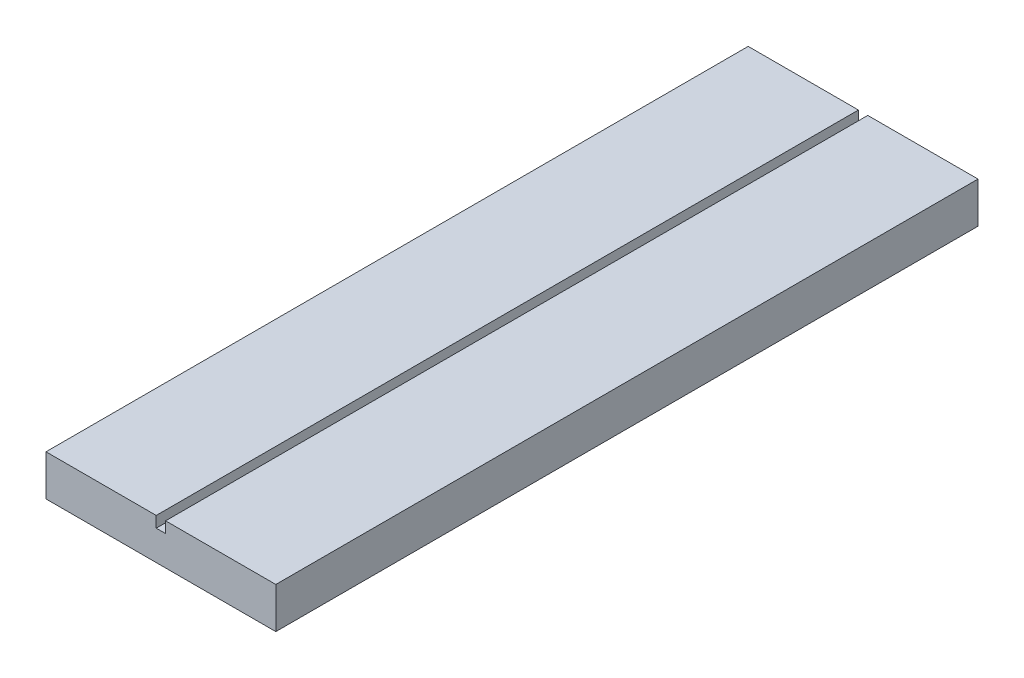
ISO-10303-21;
HEADER;
FILE_DESCRIPTION(('STEP AP214'),'2;1');
FILE_NAME('part.step','',(''),(''),'','','');
FILE_SCHEMA(('AUTOMOTIVE_DESIGN { 1 0 10303 214 1 1 1 1 }'));
ENDSEC;
DATA;
#1=APPLICATION_CONTEXT('core data for automotive mechanical design processes');
#2=APPLICATION_PROTOCOL_DEFINITION('international standard','automotive_design',2000,#1);
#3=PRODUCT_CONTEXT('',#1,'mechanical');
#4=PRODUCT('Part','Part','',(#3));
#5=PRODUCT_RELATED_PRODUCT_CATEGORY('part','',(#4));
#6=PRODUCT_DEFINITION_FORMATION('','',#4);
#7=PRODUCT_DEFINITION_CONTEXT('part definition',#1,'design');
#8=PRODUCT_DEFINITION('design','',#6,#7);
#9=PRODUCT_DEFINITION_SHAPE('','',#8);
#10=(LENGTH_UNIT() NAMED_UNIT(*) SI_UNIT(.MILLI.,.METRE.));
#11=(NAMED_UNIT(*) PLANE_ANGLE_UNIT() SI_UNIT($,.RADIAN.));
#12=(NAMED_UNIT(*) SI_UNIT($,.STERADIAN.) SOLID_ANGLE_UNIT());
#13=UNCERTAINTY_MEASURE_WITH_UNIT(LENGTH_MEASURE(1.E-05),#10,'distance_accuracy_value','');
#14=(GEOMETRIC_REPRESENTATION_CONTEXT(3) GLOBAL_UNCERTAINTY_ASSIGNED_CONTEXT((#13)) GLOBAL_UNIT_ASSIGNED_CONTEXT((#10,
#11,#12)) REPRESENTATION_CONTEXT('',''));
#15=CARTESIAN_POINT('',(0.,0.,0.));
#16=DIRECTION('',(0.,0.,1.));
#17=DIRECTION('',(1.,0.,0.));
#18=AXIS2_PLACEMENT_3D('',#15,#16,#17);
#19=CARTESIAN_POINT('',(0.,7.,0.));
#20=DIRECTION('',(0.,1.,0.));
#21=DIRECTION('',(1.,0.,0.));
#22=AXIS2_PLACEMENT_3D('',#19,#20,#21);
#23=PLANE('',#22);
#24=DIRECTION('',(-1.,0.,0.));
#25=VECTOR('',#24,1.);
#26=CARTESIAN_POINT('',(1.10000000000002,7.,-82.5));
#27=LINE('',#26,#25);
#28=CARTESIAN_POINT('',(1.10000000000002,7.,-82.5));
#29=VERTEX_POINT('',#28);
#30=CARTESIAN_POINT('',(-1.1,7.,-82.5));
#31=VERTEX_POINT('',#30);
#32=EDGE_CURVE('E151',#29,#31,#27,.T.);
#33=ORIENTED_EDGE('',*,*,#32,.T.);
#34=DIRECTION('',(0.,0.,1.));
#35=VECTOR('',#34,1.);
#36=CARTESIAN_POINT('',(-1.1,7.,-82.5));
#37=LINE('',#36,#35);
#38=CARTESIAN_POINT('',(-1.09999999999998,7.,82.5));
#39=VERTEX_POINT('',#38);
#40=EDGE_CURVE('E11',#31,#39,#37,.T.);
#41=ORIENTED_EDGE('',*,*,#40,.T.);
#42=DIRECTION('',(1.,0.,0.));
#43=VECTOR('',#42,1.);
#44=CARTESIAN_POINT('',(-1.09999999999998,7.,82.5));
#45=LINE('',#44,#43);
#46=CARTESIAN_POINT('',(1.10000000000002,7.,82.5));
#47=VERTEX_POINT('',#46);
#48=EDGE_CURVE('E108',#39,#47,#45,.T.);
#49=ORIENTED_EDGE('',*,*,#48,.T.);
#50=DIRECTION('',(0.,0.,-1.));
#51=VECTOR('',#50,1.);
#52=CARTESIAN_POINT('',(1.10000000000002,7.,82.5));
#53=LINE('',#52,#51);
#54=EDGE_CURVE('E27',#47,#29,#53,.T.);
#55=ORIENTED_EDGE('',*,*,#54,.T.);
#56=EDGE_LOOP('',(#33,#41,#49,#55));
#57=FACE_BOUND('',#56,.T.);
#58=ADVANCED_FACE('F16',(#57),#23,.T.);
#59=CARTESIAN_POINT('',(-1.1,7.,-82.5));
#60=DIRECTION('',(-1.,0.,0.));
#61=DIRECTION('',(0.,1.,0.));
#62=AXIS2_PLACEMENT_3D('',#59,#60,#61);
#63=PLANE('',#62);
#64=DIRECTION('',(0.,0.,1.));
#65=VECTOR('',#64,1.);
#66=CARTESIAN_POINT('',(-1.1,9.6,-82.5));
#67=LINE('',#66,#65);
#68=CARTESIAN_POINT('',(-1.1,9.6,-82.5));
#69=VERTEX_POINT('',#68);
#70=CARTESIAN_POINT('',(-1.09999999999998,9.6,82.5));
#71=VERTEX_POINT('',#70);
#72=EDGE_CURVE('E42',#69,#71,#67,.T.);
#73=ORIENTED_EDGE('',*,*,#72,.T.);
#74=DIRECTION('',(0.,1.,0.));
#75=VECTOR('',#74,1.);
#76=CARTESIAN_POINT('',(-1.09999999999998,7.,82.5));
#77=LINE('',#76,#75);
#78=EDGE_CURVE('E112',#39,#71,#77,.T.);
#79=ORIENTED_EDGE('',*,*,#78,.F.);
#80=ORIENTED_EDGE('',*,*,#40,.F.);
#81=DIRECTION('',(0.,1.,0.));
#82=VECTOR('',#81,1.);
#83=CARTESIAN_POINT('',(-1.1,7.,-82.5));
#84=LINE('',#83,#82);
#85=EDGE_CURVE('E134',#31,#69,#84,.T.);
#86=ORIENTED_EDGE('',*,*,#85,.T.);
#87=EDGE_LOOP('',(#73,#79,#80,#86));
#88=FACE_BOUND('',#87,.T.);
#89=ADVANCED_FACE('F305',(#88),#63,.F.);
#90=CARTESIAN_POINT('',(1.10000000000002,7.,82.5));
#91=DIRECTION('',(1.,0.,0.));
#92=DIRECTION('',(0.,0.,1.));
#93=AXIS2_PLACEMENT_3D('',#90,#91,#92);
#94=PLANE('',#93);
#95=DIRECTION('',(0.,0.,-1.));
#96=VECTOR('',#95,1.);
#97=CARTESIAN_POINT('',(1.10000000000002,9.6,82.5));
#98=LINE('',#97,#96);
#99=CARTESIAN_POINT('',(1.10000000000002,9.6,82.5));
#100=VERTEX_POINT('',#99);
#101=CARTESIAN_POINT('',(1.10000000000002,9.6,-82.5));
#102=VERTEX_POINT('',#101);
#103=EDGE_CURVE('E155',#100,#102,#98,.T.);
#104=ORIENTED_EDGE('',*,*,#103,.T.);
#105=DIRECTION('',(0.,1.,0.));
#106=VECTOR('',#105,1.);
#107=CARTESIAN_POINT('',(1.10000000000002,7.,-82.5));
#108=LINE('',#107,#106);
#109=EDGE_CURVE('E101',#29,#102,#108,.T.);
#110=ORIENTED_EDGE('',*,*,#109,.F.);
#111=ORIENTED_EDGE('',*,*,#54,.F.);
#112=DIRECTION('',(0.,1.,0.));
#113=VECTOR('',#112,1.);
#114=CARTESIAN_POINT('',(1.10000000000002,7.,82.5));
#115=LINE('',#114,#113);
#116=EDGE_CURVE('E99',#47,#100,#115,.T.);
#117=ORIENTED_EDGE('',*,*,#116,.T.);
#118=EDGE_LOOP('',(#104,#110,#111,#117));
#119=FACE_BOUND('',#118,.T.);
#120=ADVANCED_FACE('F97',(#119),#94,.F.);
#121=CARTESIAN_POINT('',(0.,0.,0.));
#122=DIRECTION('',(0.,-1.,0.));
#123=DIRECTION('',(0.,0.,-1.));
#124=AXIS2_PLACEMENT_3D('',#121,#122,#123);
#125=PLANE('',#124);
#126=DIRECTION('',(0.,0.,1.));
#127=VECTOR('',#126,1.);
#128=CARTESIAN_POINT('',(27.,0.,-82.5));
#129=LINE('',#128,#127);
#130=CARTESIAN_POINT('',(27.,0.,-82.5));
#131=VERTEX_POINT('',#130);
#132=CARTESIAN_POINT('',(27.,0.,82.5));
#133=VERTEX_POINT('',#132);
#134=EDGE_CURVE('E163',#131,#133,#129,.T.);
#135=ORIENTED_EDGE('',*,*,#134,.T.);
#136=DIRECTION('',(-1.,0.,0.));
#137=VECTOR('',#136,1.);
#138=CARTESIAN_POINT('',(27.,0.,82.5));
#139=LINE('',#138,#137);
#140=CARTESIAN_POINT('',(-27.,0.,82.5));
#141=VERTEX_POINT('',#140);
#142=EDGE_CURVE('E139',#133,#141,#139,.T.);
#143=ORIENTED_EDGE('',*,*,#142,.T.);
#144=DIRECTION('',(0.,0.,1.));
#145=VECTOR('',#144,1.);
#146=CARTESIAN_POINT('',(-27.,0.,-82.5));
#147=LINE('',#146,#145);
#148=CARTESIAN_POINT('',(-27.,0.,-82.5));
#149=VERTEX_POINT('',#148);
#150=EDGE_CURVE('E182',#149,#141,#147,.T.);
#151=ORIENTED_EDGE('',*,*,#150,.F.);
#152=DIRECTION('',(1.,0.,0.));
#153=VECTOR('',#152,1.);
#154=CARTESIAN_POINT('',(-27.,0.,-82.5));
#155=LINE('',#154,#153);
#156=EDGE_CURVE('E143',#149,#131,#155,.T.);
#157=ORIENTED_EDGE('',*,*,#156,.T.);
#158=EDGE_LOOP('',(#135,#143,#151,#157));
#159=FACE_BOUND('',#158,.T.);
#160=ADVANCED_FACE('F207',(#159),#125,.T.);
#161=CARTESIAN_POINT('',(0.,9.6,0.));
#162=DIRECTION('',(0.,-1.,0.));
#163=DIRECTION('',(0.,0.,-1.));
#164=AXIS2_PLACEMENT_3D('',#161,#162,#163);
#165=PLANE('',#164);
#166=DIRECTION('',(-1.,0.,0.));
#167=VECTOR('',#166,1.);
#168=CARTESIAN_POINT('',(27.,9.6,82.5));
#169=LINE('',#168,#167);
#170=CARTESIAN_POINT('',(-27.,9.6,82.5));
#171=VERTEX_POINT('',#170);
#172=EDGE_CURVE('E136',#71,#171,#169,.T.);
#173=ORIENTED_EDGE('',*,*,#172,.F.);
#174=ORIENTED_EDGE('',*,*,#72,.F.);
#175=DIRECTION('',(1.,0.,0.));
#176=VECTOR('',#175,1.);
#177=CARTESIAN_POINT('',(-27.,9.6,-82.5));
#178=LINE('',#177,#176);
#179=CARTESIAN_POINT('',(-27.,9.6,-82.5));
#180=VERTEX_POINT('',#179);
#181=EDGE_CURVE('E130',#180,#69,#178,.T.);
#182=ORIENTED_EDGE('',*,*,#181,.F.);
#183=DIRECTION('',(0.,0.,1.));
#184=VECTOR('',#183,1.);
#185=CARTESIAN_POINT('',(-27.,9.6,-82.5));
#186=LINE('',#185,#184);
#187=EDGE_CURVE('E119',#180,#171,#186,.T.);
#188=ORIENTED_EDGE('',*,*,#187,.T.);
#189=EDGE_LOOP('',(#173,#174,#182,#188));
#190=FACE_BOUND('',#189,.T.);
#191=ADVANCED_FACE('F18',(#190),#165,.F.);
#192=CARTESIAN_POINT('',(27.,9.6,82.5));
#193=DIRECTION('',(0.,0.,1.));
#194=DIRECTION('',(1.,0.,0.));
#195=AXIS2_PLACEMENT_3D('',#192,#193,#194);
#196=PLANE('',#195);
#197=ORIENTED_EDGE('',*,*,#116,.F.);
#198=ORIENTED_EDGE('',*,*,#48,.F.);
#199=ORIENTED_EDGE('',*,*,#78,.T.);
#200=ORIENTED_EDGE('',*,*,#172,.T.);
#201=DIRECTION('',(0.,-1.,0.));
#202=VECTOR('',#201,1.);
#203=CARTESIAN_POINT('',(-27.,9.6,82.5));
#204=LINE('',#203,#202);
#205=EDGE_CURVE('E126',#171,#141,#204,.T.);
#206=ORIENTED_EDGE('',*,*,#205,.T.);
#207=ORIENTED_EDGE('',*,*,#142,.F.);
#208=DIRECTION('',(0.,-1.,0.));
#209=VECTOR('',#208,1.);
#210=CARTESIAN_POINT('',(27.,9.6,82.5));
#211=LINE('',#210,#209);
#212=CARTESIAN_POINT('',(27.,9.6,82.5));
#213=VERTEX_POINT('',#212);
#214=EDGE_CURVE('E178',#213,#133,#211,.T.);
#215=ORIENTED_EDGE('',*,*,#214,.F.);
#216=DIRECTION('',(-1.,0.,0.));
#217=VECTOR('',#216,1.);
#218=CARTESIAN_POINT('',(27.,9.6,82.5));
#219=LINE('',#218,#217);
#220=EDGE_CURVE('E116',#213,#100,#219,.T.);
#221=ORIENTED_EDGE('',*,*,#220,.T.);
#222=EDGE_LOOP('',(#197,#198,#199,#200,#206,#207,#215,#221));
#223=FACE_BOUND('',#222,.T.);
#224=ADVANCED_FACE('F114',(#223),#196,.T.);
#225=CARTESIAN_POINT('',(-27.,9.6,-82.5));
#226=DIRECTION('',(1.,0.,0.));
#227=DIRECTION('',(0.,0.,-1.));
#228=AXIS2_PLACEMENT_3D('',#225,#226,#227);
#229=PLANE('',#228);
#230=ORIENTED_EDGE('',*,*,#150,.T.);
#231=ORIENTED_EDGE('',*,*,#205,.F.);
#232=ORIENTED_EDGE('',*,*,#187,.F.);
#233=DIRECTION('',(0.,-1.,0.));
#234=VECTOR('',#233,1.);
#235=CARTESIAN_POINT('',(-27.,9.6,-82.5));
#236=LINE('',#235,#234);
#237=EDGE_CURVE('E135',#180,#149,#236,.T.);
#238=ORIENTED_EDGE('',*,*,#237,.T.);
#239=EDGE_LOOP('',(#230,#231,#232,#238));
#240=FACE_BOUND('',#239,.T.);
#241=ADVANCED_FACE('F204',(#240),#229,.F.);
#242=CARTESIAN_POINT('',(-27.,9.6,-82.5));
#243=DIRECTION('',(0.,0.,-1.));
#244=DIRECTION('',(0.,-1.,0.));
#245=AXIS2_PLACEMENT_3D('',#242,#243,#244);
#246=PLANE('',#245);
#247=ORIENTED_EDGE('',*,*,#109,.T.);
#248=DIRECTION('',(1.,0.,0.));
#249=VECTOR('',#248,1.);
#250=CARTESIAN_POINT('',(-27.,9.6,-82.5));
#251=LINE('',#250,#249);
#252=CARTESIAN_POINT('',(27.,9.6,-82.5));
#253=VERTEX_POINT('',#252);
#254=EDGE_CURVE('E152',#102,#253,#251,.T.);
#255=ORIENTED_EDGE('',*,*,#254,.T.);
#256=DIRECTION('',(0.,-1.,0.));
#257=VECTOR('',#256,1.);
#258=CARTESIAN_POINT('',(27.,9.6,-82.5));
#259=LINE('',#258,#257);
#260=EDGE_CURVE('E171',#253,#131,#259,.T.);
#261=ORIENTED_EDGE('',*,*,#260,.T.);
#262=ORIENTED_EDGE('',*,*,#156,.F.);
#263=ORIENTED_EDGE('',*,*,#237,.F.);
#264=ORIENTED_EDGE('',*,*,#181,.T.);
#265=ORIENTED_EDGE('',*,*,#85,.F.);
#266=ORIENTED_EDGE('',*,*,#32,.F.);
#267=EDGE_LOOP('',(#247,#255,#261,#262,#263,#264,#265,#266));
#268=FACE_BOUND('',#267,.T.);
#269=ADVANCED_FACE('F307',(#268),#246,.T.);
#270=CARTESIAN_POINT('',(27.,9.6,-82.5));
#271=DIRECTION('',(1.,0.,0.));
#272=DIRECTION('',(0.,0.,-1.));
#273=AXIS2_PLACEMENT_3D('',#270,#271,#272);
#274=PLANE('',#273);
#275=ORIENTED_EDGE('',*,*,#134,.F.);
#276=ORIENTED_EDGE('',*,*,#260,.F.);
#277=DIRECTION('',(0.,0.,1.));
#278=VECTOR('',#277,1.);
#279=CARTESIAN_POINT('',(27.,9.6,-82.5));
#280=LINE('',#279,#278);
#281=EDGE_CURVE('E20',#253,#213,#280,.T.);
#282=ORIENTED_EDGE('',*,*,#281,.T.);
#283=ORIENTED_EDGE('',*,*,#214,.T.);
#284=EDGE_LOOP('',(#275,#276,#282,#283));
#285=FACE_BOUND('',#284,.T.);
#286=ADVANCED_FACE('F309',(#285),#274,.T.);
#287=CARTESIAN_POINT('',(0.,9.6,0.));
#288=DIRECTION('',(0.,-1.,0.));
#289=DIRECTION('',(0.,0.,-1.));
#290=AXIS2_PLACEMENT_3D('',#287,#288,#289);
#291=PLANE('',#290);
#292=ORIENTED_EDGE('',*,*,#254,.F.);
#293=ORIENTED_EDGE('',*,*,#103,.F.);
#294=ORIENTED_EDGE('',*,*,#220,.F.);
#295=ORIENTED_EDGE('',*,*,#281,.F.);
#296=EDGE_LOOP('',(#292,#293,#294,#295));
#297=FACE_BOUND('',#296,.T.);
#298=ADVANCED_FACE('F311',(#297),#291,.F.);
#299=CLOSED_SHELL('',(#58,#89,#120,#160,#191,#224,#241,#269,#286,#298));
#300=MANIFOLD_SOLID_BREP('B1',#299);
#301=ADVANCED_BREP_SHAPE_REPRESENTATION('',(#18,#300),#14);
#302=SHAPE_DEFINITION_REPRESENTATION(#9,#301);
ENDSEC;
END-ISO-10303-21;
